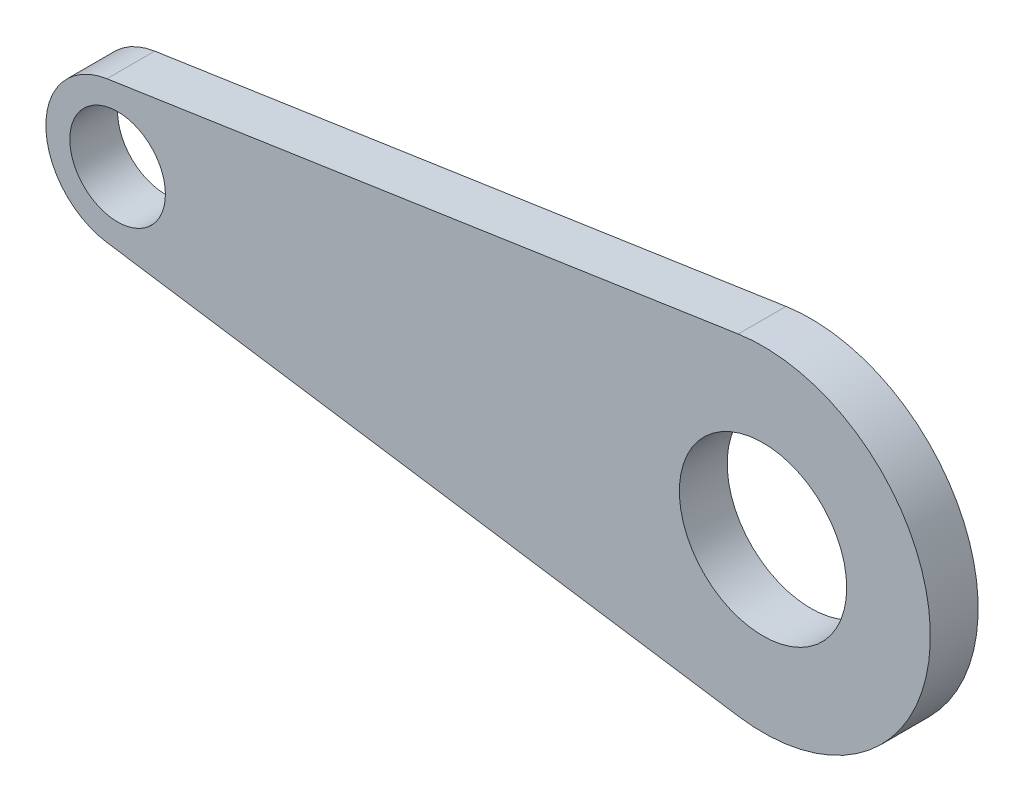
ISO-10303-21;
HEADER;
FILE_DESCRIPTION(('STEP AP214'),'2;1');
FILE_NAME('part.step','',(''),(''),'','','');
FILE_SCHEMA(('AUTOMOTIVE_DESIGN { 1 0 10303 214 1 1 1 1 }'));
ENDSEC;
DATA;
#1=APPLICATION_CONTEXT('core data for automotive mechanical design processes');
#2=APPLICATION_PROTOCOL_DEFINITION('international standard','automotive_design',2000,#1);
#3=PRODUCT_CONTEXT('',#1,'mechanical');
#4=PRODUCT('Part','Part','',(#3));
#5=PRODUCT_RELATED_PRODUCT_CATEGORY('part','',(#4));
#6=PRODUCT_DEFINITION_FORMATION('','',#4);
#7=PRODUCT_DEFINITION_CONTEXT('part definition',#1,'design');
#8=PRODUCT_DEFINITION('design','',#6,#7);
#9=PRODUCT_DEFINITION_SHAPE('','',#8);
#10=(LENGTH_UNIT() NAMED_UNIT(*) SI_UNIT(.MILLI.,.METRE.));
#11=(NAMED_UNIT(*) PLANE_ANGLE_UNIT() SI_UNIT($,.RADIAN.));
#12=(NAMED_UNIT(*) SI_UNIT($,.STERADIAN.) SOLID_ANGLE_UNIT());
#13=UNCERTAINTY_MEASURE_WITH_UNIT(LENGTH_MEASURE(1.E-05),#10,'distance_accuracy_value','');
#14=(GEOMETRIC_REPRESENTATION_CONTEXT(3) GLOBAL_UNCERTAINTY_ASSIGNED_CONTEXT((#13)) GLOBAL_UNIT_ASSIGNED_CONTEXT((#10,
#11,#12)) REPRESENTATION_CONTEXT('',''));
#15=CARTESIAN_POINT('',(0.,0.,0.));
#16=DIRECTION('',(0.,0.,1.));
#17=DIRECTION('',(1.,0.,0.));
#18=AXIS2_PLACEMENT_3D('',#15,#16,#17);
#19=CARTESIAN_POINT('',(0.,0.,1.));
#20=DIRECTION('',(0.,0.,1.));
#21=DIRECTION('',(1.,0.,0.));
#22=AXIS2_PLACEMENT_3D('',#19,#20,#21);
#23=PLANE('',#22);
#24=CARTESIAN_POINT('',(0.,0.,1.));
#25=DIRECTION('',(0.,0.,1.));
#26=DIRECTION('',(1.,0.,0.));
#27=AXIS2_PLACEMENT_3D('',#24,#25,#26);
#28=CIRCLE('',#27,1.);
#29=CARTESIAN_POINT('',(1.,0.,1.));
#30=VERTEX_POINT('',#29);
#31=EDGE_CURVE('E102',#30,#30,#28,.T.);
#32=ORIENTED_EDGE('',*,*,#31,.F.);
#33=EDGE_LOOP('',(#32));
#34=FACE_BOUND('',#33,.T.);
#35=CARTESIAN_POINT('',(0.,0.,1.));
#36=DIRECTION('',(0.,0.,1.));
#37=DIRECTION('',(1.,0.,0.));
#38=AXIS2_PLACEMENT_3D('',#35,#36,#37);
#39=CIRCLE('',#38,1.5);
#40=CARTESIAN_POINT('',(-0.222222222222222,1.48344776920208,1.));
#41=VERTEX_POINT('',#40);
#42=CARTESIAN_POINT('',(-0.222222222222222,-1.48344776920208,1.));
#43=VERTEX_POINT('',#42);
#44=EDGE_CURVE('E87',#41,#43,#39,.T.);
#45=ORIENTED_EDGE('',*,*,#44,.T.);
#46=DIRECTION('',(0.988965179468051,-0.148148148148148,0.));
#47=VECTOR('',#46,1.);
#48=CARTESIAN_POINT('',(-0.222222222222222,-1.48344776920208,1.));
#49=LINE('',#48,#47);
#50=CARTESIAN_POINT('',(12.9814814814815,-3.46137812813818,1.));
#51=VERTEX_POINT('',#50);
#52=EDGE_CURVE('E82',#43,#51,#49,.T.);
#53=ORIENTED_EDGE('',*,*,#52,.T.);
#54=CARTESIAN_POINT('',(13.5,0.,1.));
#55=DIRECTION('',(0.,0.,1.));
#56=DIRECTION('',(1.,0.,0.));
#57=AXIS2_PLACEMENT_3D('',#54,#55,#56);
#58=CIRCLE('',#57,3.5);
#59=CARTESIAN_POINT('',(12.9814814814815,3.46137812813818,1.));
#60=VERTEX_POINT('',#59);
#61=EDGE_CURVE('E85',#51,#60,#58,.T.);
#62=ORIENTED_EDGE('',*,*,#61,.T.);
#63=DIRECTION('',(-0.988965179468051,-0.148148148148148,0.));
#64=VECTOR('',#63,1.);
#65=CARTESIAN_POINT('',(-0.222222222222222,1.48344776920208,1.));
#66=LINE('',#65,#64);
#67=EDGE_CURVE('E52',#60,#41,#66,.T.);
#68=ORIENTED_EDGE('',*,*,#67,.T.);
#69=EDGE_LOOP('',(#45,#53,#62,#68));
#70=FACE_BOUND('',#69,.T.);
#71=CARTESIAN_POINT('',(13.5,0.,1.));
#72=DIRECTION('',(0.,0.,1.));
#73=DIRECTION('',(1.,0.,0.));
#74=AXIS2_PLACEMENT_3D('',#71,#72,#73);
#75=CIRCLE('',#74,1.75);
#76=CARTESIAN_POINT('',(15.25,0.,1.));
#77=VERTEX_POINT('',#76);
#78=EDGE_CURVE('E117',#77,#77,#75,.T.);
#79=ORIENTED_EDGE('',*,*,#78,.F.);
#80=EDGE_LOOP('',(#79));
#81=FACE_BOUND('',#80,.T.);
#82=ADVANCED_FACE('F35',(#34,#70,#81),#23,.T.);
#83=CARTESIAN_POINT('',(0.,0.,0.));
#84=DIRECTION('',(0.,0.,1.));
#85=DIRECTION('',(1.,0.,0.));
#86=AXIS2_PLACEMENT_3D('',#83,#84,#85);
#87=PLANE('',#86);
#88=CARTESIAN_POINT('',(0.,0.,0.));
#89=DIRECTION('',(0.,0.,1.));
#90=DIRECTION('',(1.,0.,0.));
#91=AXIS2_PLACEMENT_3D('',#88,#89,#90);
#92=CIRCLE('',#91,1.5);
#93=CARTESIAN_POINT('',(-0.222222222222222,1.48344776920208,0.));
#94=VERTEX_POINT('',#93);
#95=CARTESIAN_POINT('',(-0.222222222222222,-1.48344776920208,0.));
#96=VERTEX_POINT('',#95);
#97=EDGE_CURVE('E99',#94,#96,#92,.T.);
#98=ORIENTED_EDGE('',*,*,#97,.F.);
#99=DIRECTION('',(-0.988965179468051,-0.148148148148148,0.));
#100=VECTOR('',#99,1.);
#101=CARTESIAN_POINT('',(-0.222222222222222,1.48344776920208,0.));
#102=LINE('',#101,#100);
#103=CARTESIAN_POINT('',(12.9814814814815,3.46137812813818,0.));
#104=VERTEX_POINT('',#103);
#105=EDGE_CURVE('E75',#104,#94,#102,.T.);
#106=ORIENTED_EDGE('',*,*,#105,.F.);
#107=CARTESIAN_POINT('',(13.5,0.,0.));
#108=DIRECTION('',(0.,0.,1.));
#109=DIRECTION('',(1.,0.,0.));
#110=AXIS2_PLACEMENT_3D('',#107,#108,#109);
#111=CIRCLE('',#110,3.5);
#112=CARTESIAN_POINT('',(12.9814814814815,-3.46137812813818,0.));
#113=VERTEX_POINT('',#112);
#114=EDGE_CURVE('E69',#113,#104,#111,.T.);
#115=ORIENTED_EDGE('',*,*,#114,.F.);
#116=DIRECTION('',(0.988965179468051,-0.148148148148148,0.));
#117=VECTOR('',#116,1.);
#118=CARTESIAN_POINT('',(-0.222222222222222,-1.48344776920208,0.));
#119=LINE('',#118,#117);
#120=EDGE_CURVE('E91',#96,#113,#119,.T.);
#121=ORIENTED_EDGE('',*,*,#120,.F.);
#122=EDGE_LOOP('',(#98,#106,#115,#121));
#123=FACE_BOUND('',#122,.T.);
#124=CARTESIAN_POINT('',(0.,0.,0.));
#125=DIRECTION('',(0.,0.,1.));
#126=DIRECTION('',(1.,0.,0.));
#127=AXIS2_PLACEMENT_3D('',#124,#125,#126);
#128=CIRCLE('',#127,1.);
#129=CARTESIAN_POINT('',(1.,0.,0.));
#130=VERTEX_POINT('',#129);
#131=EDGE_CURVE('E114',#130,#130,#128,.T.);
#132=ORIENTED_EDGE('',*,*,#131,.T.);
#133=EDGE_LOOP('',(#132));
#134=FACE_BOUND('',#133,.T.);
#135=CARTESIAN_POINT('',(13.5,0.,0.));
#136=DIRECTION('',(0.,0.,1.));
#137=DIRECTION('',(1.,0.,0.));
#138=AXIS2_PLACEMENT_3D('',#135,#136,#137);
#139=CIRCLE('',#138,1.75);
#140=CARTESIAN_POINT('',(15.25,0.,0.));
#141=VERTEX_POINT('',#140);
#142=EDGE_CURVE('E120',#141,#141,#139,.T.);
#143=ORIENTED_EDGE('',*,*,#142,.T.);
#144=EDGE_LOOP('',(#143));
#145=FACE_BOUND('',#144,.T.);
#146=ADVANCED_FACE('F110',(#123,#134,#145),#87,.F.);
#147=CARTESIAN_POINT('',(0.,0.,1.));
#148=DIRECTION('',(0.,0.,-1.));
#149=DIRECTION('',(-1.,0.,0.));
#150=AXIS2_PLACEMENT_3D('',#147,#148,#149);
#151=CYLINDRICAL_SURFACE('',#150,1.5);
#152=ORIENTED_EDGE('',*,*,#97,.T.);
#153=DIRECTION('',(0.,0.,-1.));
#154=VECTOR('',#153,1.);
#155=CARTESIAN_POINT('',(-0.222222222222222,-1.48344776920208,1.));
#156=LINE('',#155,#154);
#157=EDGE_CURVE('E11',#43,#96,#156,.T.);
#158=ORIENTED_EDGE('',*,*,#157,.F.);
#159=ORIENTED_EDGE('',*,*,#44,.F.);
#160=DIRECTION('',(0.,0.,-1.));
#161=VECTOR('',#160,1.);
#162=CARTESIAN_POINT('',(-0.222222222222222,1.48344776920208,1.));
#163=LINE('',#162,#161);
#164=EDGE_CURVE('E95',#41,#94,#163,.T.);
#165=ORIENTED_EDGE('',*,*,#164,.T.);
#166=EDGE_LOOP('',(#152,#158,#159,#165));
#167=FACE_BOUND('',#166,.T.);
#168=ADVANCED_FACE('F37',(#167),#151,.T.);
#169=CARTESIAN_POINT('',(-0.222222222222222,-1.48344776920208,1.));
#170=DIRECTION('',(0.148148148148148,0.988965179468051,0.));
#171=DIRECTION('',(-0.988965179468051,0.148148148148148,0.));
#172=AXIS2_PLACEMENT_3D('',#169,#170,#171);
#173=PLANE('',#172);
#174=ORIENTED_EDGE('',*,*,#120,.T.);
#175=DIRECTION('',(0.,0.,-1.));
#176=VECTOR('',#175,1.);
#177=CARTESIAN_POINT('',(12.9814814814815,-3.46137812813818,1.));
#178=LINE('',#177,#176);
#179=EDGE_CURVE('E44',#51,#113,#178,.T.);
#180=ORIENTED_EDGE('',*,*,#179,.F.);
#181=ORIENTED_EDGE('',*,*,#52,.F.);
#182=ORIENTED_EDGE('',*,*,#157,.T.);
#183=EDGE_LOOP('',(#174,#180,#181,#182));
#184=FACE_BOUND('',#183,.T.);
#185=ADVANCED_FACE('F90',(#184),#173,.F.);
#186=CARTESIAN_POINT('',(13.5,0.,1.));
#187=DIRECTION('',(0.,0.,-1.));
#188=DIRECTION('',(-1.,0.,0.));
#189=AXIS2_PLACEMENT_3D('',#186,#187,#188);
#190=CYLINDRICAL_SURFACE('',#189,3.5);
#191=ORIENTED_EDGE('',*,*,#114,.T.);
#192=DIRECTION('',(0.,0.,-1.));
#193=VECTOR('',#192,1.);
#194=CARTESIAN_POINT('',(12.9814814814815,3.46137812813818,1.));
#195=LINE('',#194,#193);
#196=EDGE_CURVE('E92',#60,#104,#195,.T.);
#197=ORIENTED_EDGE('',*,*,#196,.F.);
#198=ORIENTED_EDGE('',*,*,#61,.F.);
#199=ORIENTED_EDGE('',*,*,#179,.T.);
#200=EDGE_LOOP('',(#191,#197,#198,#199));
#201=FACE_BOUND('',#200,.T.);
#202=ADVANCED_FACE('F93',(#201),#190,.T.);
#203=CARTESIAN_POINT('',(-0.222222222222222,1.48344776920208,1.));
#204=DIRECTION('',(0.148148148148148,-0.988965179468051,0.));
#205=DIRECTION('',(0.988965179468051,0.148148148148148,0.));
#206=AXIS2_PLACEMENT_3D('',#203,#204,#205);
#207=PLANE('',#206);
#208=ORIENTED_EDGE('',*,*,#105,.T.);
#209=ORIENTED_EDGE('',*,*,#164,.F.);
#210=ORIENTED_EDGE('',*,*,#67,.F.);
#211=ORIENTED_EDGE('',*,*,#196,.T.);
#212=EDGE_LOOP('',(#208,#209,#210,#211));
#213=FACE_BOUND('',#212,.T.);
#214=ADVANCED_FACE('F107',(#213),#207,.F.);
#215=CARTESIAN_POINT('',(0.,0.,1.));
#216=DIRECTION('',(0.,0.,-1.));
#217=DIRECTION('',(-1.,0.,0.));
#218=AXIS2_PLACEMENT_3D('',#215,#216,#217);
#219=CYLINDRICAL_SURFACE('',#218,1.);
#220=ORIENTED_EDGE('',*,*,#31,.T.);
#221=EDGE_LOOP('',(#220));
#222=FACE_BOUND('',#221,.T.);
#223=ORIENTED_EDGE('',*,*,#131,.F.);
#224=EDGE_LOOP('',(#223));
#225=FACE_BOUND('',#224,.T.);
#226=ADVANCED_FACE('F137',(#222,#225),#219,.F.);
#227=CARTESIAN_POINT('',(13.5,0.,1.));
#228=DIRECTION('',(0.,0.,-1.));
#229=DIRECTION('',(-1.,0.,0.));
#230=AXIS2_PLACEMENT_3D('',#227,#228,#229);
#231=CYLINDRICAL_SURFACE('',#230,1.75);
#232=ORIENTED_EDGE('',*,*,#78,.T.);
#233=EDGE_LOOP('',(#232));
#234=FACE_BOUND('',#233,.T.);
#235=ORIENTED_EDGE('',*,*,#142,.F.);
#236=EDGE_LOOP('',(#235));
#237=FACE_BOUND('',#236,.T.);
#238=ADVANCED_FACE('F126',(#234,#237),#231,.F.);
#239=CLOSED_SHELL('',(#82,#146,#168,#185,#202,#214,#226,#238));
#240=MANIFOLD_SOLID_BREP('B2',#239);
#241=ADVANCED_BREP_SHAPE_REPRESENTATION('',(#18,#240),#14);
#242=SHAPE_DEFINITION_REPRESENTATION(#9,#241);
ENDSEC;
END-ISO-10303-21;
